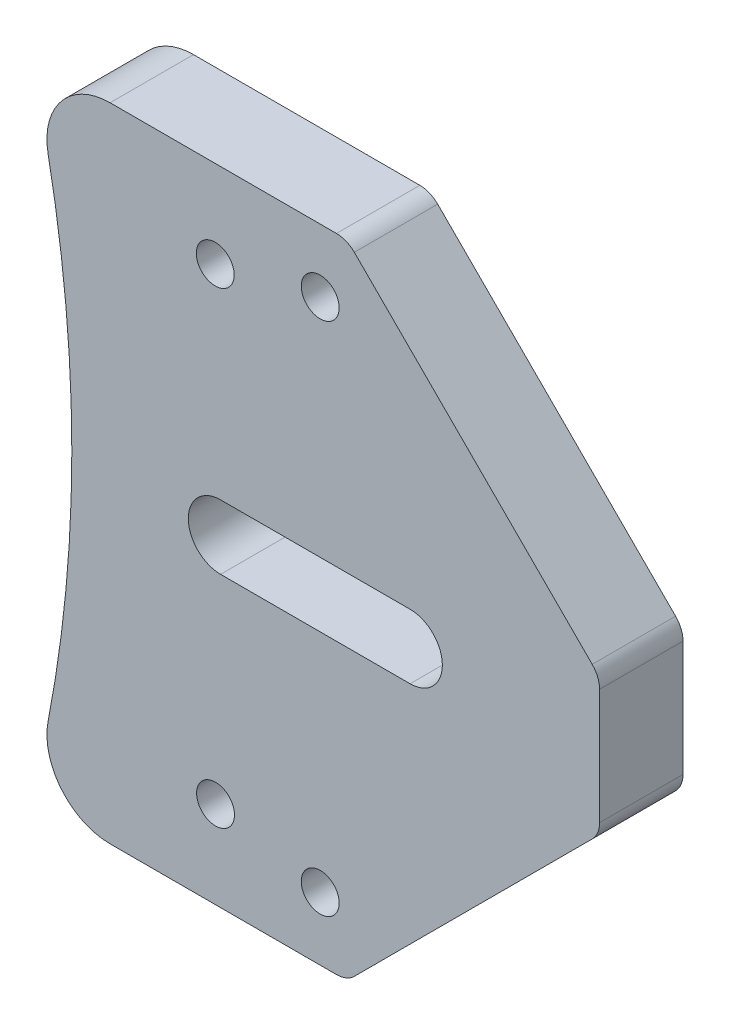
ISO-10303-21;
HEADER;
FILE_DESCRIPTION(('STEP AP214'),'2;1');
FILE_NAME('part.step','',(''),(''),'','','');
FILE_SCHEMA(('AUTOMOTIVE_DESIGN { 1 0 10303 214 1 1 1 1 }'));
ENDSEC;
DATA;
#1=APPLICATION_CONTEXT('core data for automotive mechanical design processes');
#2=APPLICATION_PROTOCOL_DEFINITION('international standard','automotive_design',2000,#1);
#3=PRODUCT_CONTEXT('',#1,'mechanical');
#4=PRODUCT('Part','Part','',(#3));
#5=PRODUCT_RELATED_PRODUCT_CATEGORY('part','',(#4));
#6=PRODUCT_DEFINITION_FORMATION('','',#4);
#7=PRODUCT_DEFINITION_CONTEXT('part definition',#1,'design');
#8=PRODUCT_DEFINITION('design','',#6,#7);
#9=PRODUCT_DEFINITION_SHAPE('','',#8);
#10=(LENGTH_UNIT() NAMED_UNIT(*) SI_UNIT(.MILLI.,.METRE.));
#11=(NAMED_UNIT(*) PLANE_ANGLE_UNIT() SI_UNIT($,.RADIAN.));
#12=(NAMED_UNIT(*) SI_UNIT($,.STERADIAN.) SOLID_ANGLE_UNIT());
#13=UNCERTAINTY_MEASURE_WITH_UNIT(LENGTH_MEASURE(1.E-05),#10,'distance_accuracy_value','');
#14=(GEOMETRIC_REPRESENTATION_CONTEXT(3) GLOBAL_UNCERTAINTY_ASSIGNED_CONTEXT((#13)) GLOBAL_UNIT_ASSIGNED_CONTEXT((#10,
#11,#12)) REPRESENTATION_CONTEXT('',''));
#15=CARTESIAN_POINT('',(0.,0.,0.));
#16=DIRECTION('',(0.,0.,1.));
#17=DIRECTION('',(1.,0.,0.));
#18=AXIS2_PLACEMENT_3D('',#15,#16,#17);
#19=CARTESIAN_POINT('',(20.5,4.5715728752538,6.6));
#20=DIRECTION('',(0.,0.,1.));
#21=DIRECTION('',(1.,0.,0.));
#22=AXIS2_PLACEMENT_3D('',#19,#20,#21);
#23=PLANE('',#22);
#24=CARTESIAN_POINT('',(-7.8991396333,-18.5,6.6));
#25=DIRECTION('',(0.,0.,1.));
#26=DIRECTION('',(1.,0.,0.));
#27=AXIS2_PLACEMENT_3D('',#24,#25,#26);
#28=CIRCLE('',#27,1.50000000000002);
#29=CARTESIAN_POINT('',(-6.39913963329998,-18.5,6.6));
#30=VERTEX_POINT('',#29);
#31=EDGE_CURVE('E182',#30,#30,#28,.T.);
#32=ORIENTED_EDGE('',*,*,#31,.F.);
#33=EDGE_LOOP('',(#32));
#34=FACE_BOUND('',#33,.T.);
#35=CARTESIAN_POINT('',(0.3857864376,-20.4,6.6));
#36=DIRECTION('',(0.,0.,1.));
#37=DIRECTION('',(1.,0.,0.));
#38=AXIS2_PLACEMENT_3D('',#35,#36,#37);
#39=CIRCLE('',#38,1.50000000000009);
#40=CARTESIAN_POINT('',(1.88578643760009,-20.4,6.6));
#41=VERTEX_POINT('',#40);
#42=EDGE_CURVE('E194',#41,#41,#39,.T.);
#43=ORIENTED_EDGE('',*,*,#42,.F.);
#44=EDGE_LOOP('',(#43));
#45=FACE_BOUND('',#44,.T.);
#46=CARTESIAN_POINT('',(20.5,4.5715728752538,6.6));
#47=DIRECTION('',(0.,0.,1.));
#48=DIRECTION('',(1.,0.,0.));
#49=AXIS2_PLACEMENT_3D('',#46,#47,#48);
#50=CIRCLE('',#49,2.00000000000002);
#51=CARTESIAN_POINT('',(22.5,4.5715728753,6.6));
#52=VERTEX_POINT('',#51);
#53=CARTESIAN_POINT('',(21.9142135624,5.9857864376,6.6));
#54=VERTEX_POINT('',#53);
#55=EDGE_CURVE('E206',#52,#54,#50,.T.);
#56=ORIENTED_EDGE('',*,*,#55,.T.);
#57=DIRECTION('',(-0.707106781186547,0.707106781186547,0.));
#58=VECTOR('',#57,1.);
#59=CARTESIAN_POINT('',(21.9142135624,5.9857864376,6.6));
#60=LINE('',#59,#58);
#61=CARTESIAN_POINT('',(3.0857864376,24.8142135624,6.6));
#62=VERTEX_POINT('',#61);
#63=EDGE_CURVE('E209',#54,#62,#60,.T.);
#64=ORIENTED_EDGE('',*,*,#63,.T.);
#65=CARTESIAN_POINT('',(1.67157287525381,23.4,6.6));
#66=DIRECTION('',(0.,0.,1.));
#67=DIRECTION('',(1.,0.,0.));
#68=AXIS2_PLACEMENT_3D('',#65,#66,#67);
#69=CIRCLE('',#68,2.00000000000001);
#70=CARTESIAN_POINT('',(1.6715728753,25.4,6.6));
#71=VERTEX_POINT('',#70);
#72=EDGE_CURVE('E212',#62,#71,#69,.T.);
#73=ORIENTED_EDGE('',*,*,#72,.T.);
#74=DIRECTION('',(-1.,0.,0.));
#75=VECTOR('',#74,1.);
#76=CARTESIAN_POINT('',(1.6715728753,25.4,6.6));
#77=LINE('',#76,#75);
#78=CARTESIAN_POINT('',(-16.2439533295,25.4,6.6));
#79=VERTEX_POINT('',#78);
#80=EDGE_CURVE('E214',#71,#79,#77,.T.);
#81=ORIENTED_EDGE('',*,*,#80,.T.);
#82=CARTESIAN_POINT('',(-16.2439533295,20.4,6.6));
#83=DIRECTION('',(0.,0.,1.));
#84=DIRECTION('',(1.,0.,0.));
#85=AXIS2_PLACEMENT_3D('',#82,#83,#84);
#86=CIRCLE('',#85,5.);
#87=CARTESIAN_POINT('',(-21.1515435576518,19.4431519699825,6.6));
#88=VERTEX_POINT('',#87);
#89=EDGE_CURVE('E216',#79,#88,#86,.T.);
#90=ORIENTED_EDGE('',*,*,#89,.T.);
#91=CARTESIAN_POINT('',(-120.873776993695,2.36315810732406E-11,6.6));
#92=DIRECTION('',(0.,0.,-1.));
#93=DIRECTION('',(1.,0.,0.));
#94=AXIS2_PLACEMENT_3D('',#91,#92,#93);
#95=CIRCLE('',#94,101.599999999998);
#96=CARTESIAN_POINT('',(-21.1515435576556,-19.4431519699543,6.6));
#97=VERTEX_POINT('',#96);
#98=EDGE_CURVE('E218',#88,#97,#95,.T.);
#99=ORIENTED_EDGE('',*,*,#98,.T.);
#100=CARTESIAN_POINT('',(-16.2439533295092,-20.4,6.6));
#101=DIRECTION('',(0.,0.,1.));
#102=DIRECTION('',(1.,0.,0.));
#103=AXIS2_PLACEMENT_3D('',#100,#101,#102);
#104=CIRCLE('',#103,5.00000000000001);
#105=CARTESIAN_POINT('',(-16.2439533295,-25.4,6.6));
#106=VERTEX_POINT('',#105);
#107=EDGE_CURVE('E220',#97,#106,#104,.T.);
#108=ORIENTED_EDGE('',*,*,#107,.T.);
#109=DIRECTION('',(1.,0.,0.));
#110=VECTOR('',#109,1.);
#111=CARTESIAN_POINT('',(-16.2439533295,-25.4,6.6));
#112=LINE('',#111,#110);
#113=CARTESIAN_POINT('',(1.6715728753,-25.4,6.6));
#114=VERTEX_POINT('',#113);
#115=EDGE_CURVE('E222',#106,#114,#112,.T.);
#116=ORIENTED_EDGE('',*,*,#115,.T.);
#117=CARTESIAN_POINT('',(1.67157287525383,-23.4,6.6));
#118=DIRECTION('',(0.,0.,1.));
#119=DIRECTION('',(1.,0.,0.));
#120=AXIS2_PLACEMENT_3D('',#117,#118,#119);
#121=CIRCLE('',#120,1.99999999999995);
#122=CARTESIAN_POINT('',(3.0857864376,-24.8142135624,6.6));
#123=VERTEX_POINT('',#122);
#124=EDGE_CURVE('E224',#114,#123,#121,.T.);
#125=ORIENTED_EDGE('',*,*,#124,.T.);
#126=DIRECTION('',(0.707106781186547,0.707106781186547,0.));
#127=VECTOR('',#126,1.);
#128=CARTESIAN_POINT('',(3.0857864376,-24.8142135624,6.6));
#129=LINE('',#128,#127);
#130=CARTESIAN_POINT('',(21.9142135624,-5.9857864376,6.6));
#131=VERTEX_POINT('',#130);
#132=EDGE_CURVE('E226',#123,#131,#129,.T.);
#133=ORIENTED_EDGE('',*,*,#132,.T.);
#134=CARTESIAN_POINT('',(20.5,-4.57157287525381,6.6));
#135=DIRECTION('',(0.,0.,1.));
#136=DIRECTION('',(1.,0.,0.));
#137=AXIS2_PLACEMENT_3D('',#134,#135,#136);
#138=CIRCLE('',#137,1.99999999999999);
#139=CARTESIAN_POINT('',(22.5,-4.5715728753,6.6));
#140=VERTEX_POINT('',#139);
#141=EDGE_CURVE('E228',#131,#140,#138,.T.);
#142=ORIENTED_EDGE('',*,*,#141,.T.);
#143=DIRECTION('',(0.,1.,0.));
#144=VECTOR('',#143,1.);
#145=CARTESIAN_POINT('',(22.5,-4.5715728753,6.6));
#146=LINE('',#145,#144);
#147=EDGE_CURVE('E230',#140,#52,#146,.T.);
#148=ORIENTED_EDGE('',*,*,#147,.T.);
#149=EDGE_LOOP('',(#56,#64,#73,#81,#90,#99,#108,#116,#125,#133,#142,#148));
#150=FACE_BOUND('',#149,.T.);
#151=CARTESIAN_POINT('',(0.3857864376,20.4,6.6));
#152=DIRECTION('',(0.,0.,1.));
#153=DIRECTION('',(1.,0.,0.));
#154=AXIS2_PLACEMENT_3D('',#151,#152,#153);
#155=CIRCLE('',#154,1.50000000000008);
#156=CARTESIAN_POINT('',(1.88578643760008,20.4,6.6));
#157=VERTEX_POINT('',#156);
#158=EDGE_CURVE('E200',#157,#157,#155,.T.);
#159=ORIENTED_EDGE('',*,*,#158,.F.);
#160=EDGE_LOOP('',(#159));
#161=FACE_BOUND('',#160,.T.);
#162=CARTESIAN_POINT('',(-7.922562904,18.5,6.6));
#163=DIRECTION('',(0.,0.,1.));
#164=DIRECTION('',(1.,0.,0.));
#165=AXIS2_PLACEMENT_3D('',#162,#163,#164);
#166=CIRCLE('',#165,1.5);
#167=CARTESIAN_POINT('',(-6.422562904,18.5,6.6));
#168=VERTEX_POINT('',#167);
#169=EDGE_CURVE('E188',#168,#168,#166,.T.);
#170=ORIENTED_EDGE('',*,*,#169,.F.);
#171=EDGE_LOOP('',(#170));
#172=FACE_BOUND('',#171,.T.);
#173=DIRECTION('',(1.,0.,0.));
#174=VECTOR('',#173,1.);
#175=CARTESIAN_POINT('',(-7.5,-2.5527,6.6));
#176=LINE('',#175,#174);
#177=CARTESIAN_POINT('',(-7.5,-2.5527,6.6));
#178=VERTEX_POINT('',#177);
#179=CARTESIAN_POINT('',(7.5,-2.5527,6.6));
#180=VERTEX_POINT('',#179);
#181=EDGE_CURVE('E154',#178,#180,#176,.T.);
#182=ORIENTED_EDGE('',*,*,#181,.F.);
#183=CARTESIAN_POINT('',(-7.5,0.,6.6));
#184=DIRECTION('',(0.,0.,1.));
#185=DIRECTION('',(1.,0.,0.));
#186=AXIS2_PLACEMENT_3D('',#183,#184,#185);
#187=CIRCLE('',#186,2.5527);
#188=CARTESIAN_POINT('',(-7.5,2.5527,6.6));
#189=VERTEX_POINT('',#188);
#190=EDGE_CURVE('E146',#189,#178,#187,.T.);
#191=ORIENTED_EDGE('',*,*,#190,.F.);
#192=DIRECTION('',(-1.,0.,0.));
#193=VECTOR('',#192,1.);
#194=CARTESIAN_POINT('',(7.5,2.5527,6.6));
#195=LINE('',#194,#193);
#196=CARTESIAN_POINT('',(7.5,2.5527,6.6));
#197=VERTEX_POINT('',#196);
#198=EDGE_CURVE('E168',#197,#189,#195,.T.);
#199=ORIENTED_EDGE('',*,*,#198,.F.);
#200=CARTESIAN_POINT('',(7.5,0.,6.6));
#201=DIRECTION('',(0.,0.,1.));
#202=DIRECTION('',(1.,0.,0.));
#203=AXIS2_PLACEMENT_3D('',#200,#201,#202);
#204=CIRCLE('',#203,2.5527);
#205=EDGE_CURVE('E166',#180,#197,#204,.T.);
#206=ORIENTED_EDGE('',*,*,#205,.F.);
#207=EDGE_LOOP('',(#182,#191,#199,#206));
#208=FACE_BOUND('',#207,.T.);
#209=ADVANCED_FACE('F33',(#34,#45,#150,#161,#172,#208),#23,.T.);
#210=CARTESIAN_POINT('',(20.5,4.5715728752538,0.));
#211=DIRECTION('',(0.,0.,1.));
#212=DIRECTION('',(1.,0.,0.));
#213=AXIS2_PLACEMENT_3D('',#210,#211,#212);
#214=PLANE('',#213);
#215=CARTESIAN_POINT('',(-7.8991396333,-18.5,0.));
#216=DIRECTION('',(0.,0.,1.));
#217=DIRECTION('',(1.,0.,0.));
#218=AXIS2_PLACEMENT_3D('',#215,#216,#217);
#219=CIRCLE('',#218,1.50000000000002);
#220=CARTESIAN_POINT('',(-6.39913963329998,-18.5,0.));
#221=VERTEX_POINT('',#220);
#222=EDGE_CURVE('E162',#221,#221,#219,.T.);
#223=ORIENTED_EDGE('',*,*,#222,.T.);
#224=EDGE_LOOP('',(#223));
#225=FACE_BOUND('',#224,.T.);
#226=CARTESIAN_POINT('',(0.3857864376,-20.4,0.));
#227=DIRECTION('',(0.,0.,1.));
#228=DIRECTION('',(1.,0.,0.));
#229=AXIS2_PLACEMENT_3D('',#226,#227,#228);
#230=CIRCLE('',#229,1.50000000000009);
#231=CARTESIAN_POINT('',(1.88578643760009,-20.4,0.));
#232=VERTEX_POINT('',#231);
#233=EDGE_CURVE('E191',#232,#232,#230,.T.);
#234=ORIENTED_EDGE('',*,*,#233,.T.);
#235=EDGE_LOOP('',(#234));
#236=FACE_BOUND('',#235,.T.);
#237=CARTESIAN_POINT('',(20.5,4.5715728752538,0.));
#238=DIRECTION('',(0.,0.,1.));
#239=DIRECTION('',(1.,0.,0.));
#240=AXIS2_PLACEMENT_3D('',#237,#238,#239);
#241=CIRCLE('',#240,2.00000000000002);
#242=CARTESIAN_POINT('',(22.5,4.5715728753,0.));
#243=VERTEX_POINT('',#242);
#244=CARTESIAN_POINT('',(21.9142135624,5.9857864376,0.));
#245=VERTEX_POINT('',#244);
#246=EDGE_CURVE('E203',#243,#245,#241,.T.);
#247=ORIENTED_EDGE('',*,*,#246,.F.);
#248=DIRECTION('',(0.,1.,0.));
#249=VECTOR('',#248,1.);
#250=CARTESIAN_POINT('',(22.5,-4.5715728753,0.));
#251=LINE('',#250,#249);
#252=CARTESIAN_POINT('',(22.5,-4.5715728753,0.));
#253=VERTEX_POINT('',#252);
#254=EDGE_CURVE('E210',#253,#243,#251,.T.);
#255=ORIENTED_EDGE('',*,*,#254,.F.);
#256=CARTESIAN_POINT('',(20.5,-4.57157287525381,0.));
#257=DIRECTION('',(0.,0.,1.));
#258=DIRECTION('',(1.,0.,0.));
#259=AXIS2_PLACEMENT_3D('',#256,#257,#258);
#260=CIRCLE('',#259,1.99999999999999);
#261=CARTESIAN_POINT('',(21.9142135624,-5.9857864376,0.));
#262=VERTEX_POINT('',#261);
#263=EDGE_CURVE('E253',#262,#253,#260,.T.);
#264=ORIENTED_EDGE('',*,*,#263,.F.);
#265=DIRECTION('',(0.707106781186547,0.707106781186547,0.));
#266=VECTOR('',#265,1.);
#267=CARTESIAN_POINT('',(3.0857864376,-24.8142135624,0.));
#268=LINE('',#267,#266);
#269=CARTESIAN_POINT('',(3.0857864376,-24.8142135624,0.));
#270=VERTEX_POINT('',#269);
#271=EDGE_CURVE('E251',#270,#262,#268,.T.);
#272=ORIENTED_EDGE('',*,*,#271,.F.);
#273=CARTESIAN_POINT('',(1.67157287525383,-23.4,0.));
#274=DIRECTION('',(0.,0.,1.));
#275=DIRECTION('',(1.,0.,0.));
#276=AXIS2_PLACEMENT_3D('',#273,#274,#275);
#277=CIRCLE('',#276,1.99999999999995);
#278=CARTESIAN_POINT('',(1.6715728753,-25.4,0.));
#279=VERTEX_POINT('',#278);
#280=EDGE_CURVE('E249',#279,#270,#277,.T.);
#281=ORIENTED_EDGE('',*,*,#280,.F.);
#282=DIRECTION('',(1.,0.,0.));
#283=VECTOR('',#282,1.);
#284=CARTESIAN_POINT('',(-16.2439533295,-25.4,0.));
#285=LINE('',#284,#283);
#286=CARTESIAN_POINT('',(-16.2439533295,-25.4,0.));
#287=VERTEX_POINT('',#286);
#288=EDGE_CURVE('E247',#287,#279,#285,.T.);
#289=ORIENTED_EDGE('',*,*,#288,.F.);
#290=CARTESIAN_POINT('',(-16.2439533295092,-20.4,0.));
#291=DIRECTION('',(0.,0.,1.));
#292=DIRECTION('',(1.,0.,0.));
#293=AXIS2_PLACEMENT_3D('',#290,#291,#292);
#294=CIRCLE('',#293,5.00000000000001);
#295=CARTESIAN_POINT('',(-21.1515435576556,-19.4431519699543,0.));
#296=VERTEX_POINT('',#295);
#297=EDGE_CURVE('E245',#296,#287,#294,.T.);
#298=ORIENTED_EDGE('',*,*,#297,.F.);
#299=CARTESIAN_POINT('',(-120.873776993695,2.36315810732406E-11,0.));
#300=DIRECTION('',(0.,0.,-1.));
#301=DIRECTION('',(1.,0.,0.));
#302=AXIS2_PLACEMENT_3D('',#299,#300,#301);
#303=CIRCLE('',#302,101.599999999998);
#304=CARTESIAN_POINT('',(-21.1515435576518,19.4431519699825,0.));
#305=VERTEX_POINT('',#304);
#306=EDGE_CURVE('E243',#305,#296,#303,.T.);
#307=ORIENTED_EDGE('',*,*,#306,.F.);
#308=CARTESIAN_POINT('',(-16.2439533295,20.4,0.));
#309=DIRECTION('',(0.,0.,1.));
#310=DIRECTION('',(1.,0.,0.));
#311=AXIS2_PLACEMENT_3D('',#308,#309,#310);
#312=CIRCLE('',#311,5.);
#313=CARTESIAN_POINT('',(-16.2439533295,25.4,0.));
#314=VERTEX_POINT('',#313);
#315=EDGE_CURVE('E241',#314,#305,#312,.T.);
#316=ORIENTED_EDGE('',*,*,#315,.F.);
#317=DIRECTION('',(-1.,0.,0.));
#318=VECTOR('',#317,1.);
#319=CARTESIAN_POINT('',(1.6715728753,25.4,0.));
#320=LINE('',#319,#318);
#321=CARTESIAN_POINT('',(1.6715728753,25.4,0.));
#322=VERTEX_POINT('',#321);
#323=EDGE_CURVE('E239',#322,#314,#320,.T.);
#324=ORIENTED_EDGE('',*,*,#323,.F.);
#325=CARTESIAN_POINT('',(1.67157287525381,23.4,0.));
#326=DIRECTION('',(0.,0.,1.));
#327=DIRECTION('',(1.,0.,0.));
#328=AXIS2_PLACEMENT_3D('',#325,#326,#327);
#329=CIRCLE('',#328,2.00000000000001);
#330=CARTESIAN_POINT('',(3.0857864376,24.8142135624,0.));
#331=VERTEX_POINT('',#330);
#332=EDGE_CURVE('E237',#331,#322,#329,.T.);
#333=ORIENTED_EDGE('',*,*,#332,.F.);
#334=DIRECTION('',(-0.707106781186547,0.707106781186547,0.));
#335=VECTOR('',#334,1.);
#336=CARTESIAN_POINT('',(21.9142135624,5.9857864376,0.));
#337=LINE('',#336,#335);
#338=EDGE_CURVE('E235',#245,#331,#337,.T.);
#339=ORIENTED_EDGE('',*,*,#338,.F.);
#340=EDGE_LOOP('',(#247,#255,#264,#272,#281,#289,#298,#307,#316,#324,#333,#339));
#341=FACE_BOUND('',#340,.T.);
#342=CARTESIAN_POINT('',(0.3857864376,20.4,0.));
#343=DIRECTION('',(0.,0.,1.));
#344=DIRECTION('',(1.,0.,0.));
#345=AXIS2_PLACEMENT_3D('',#342,#343,#344);
#346=CIRCLE('',#345,1.50000000000008);
#347=CARTESIAN_POINT('',(1.88578643760008,20.4,0.));
#348=VERTEX_POINT('',#347);
#349=EDGE_CURVE('E197',#348,#348,#346,.T.);
#350=ORIENTED_EDGE('',*,*,#349,.T.);
#351=EDGE_LOOP('',(#350));
#352=FACE_BOUND('',#351,.T.);
#353=CARTESIAN_POINT('',(-7.922562904,18.5,0.));
#354=DIRECTION('',(0.,0.,1.));
#355=DIRECTION('',(1.,0.,0.));
#356=AXIS2_PLACEMENT_3D('',#353,#354,#355);
#357=CIRCLE('',#356,1.5);
#358=CARTESIAN_POINT('',(-6.422562904,18.5,0.));
#359=VERTEX_POINT('',#358);
#360=EDGE_CURVE('E185',#359,#359,#357,.T.);
#361=ORIENTED_EDGE('',*,*,#360,.T.);
#362=EDGE_LOOP('',(#361));
#363=FACE_BOUND('',#362,.T.);
#364=CARTESIAN_POINT('',(-7.5,0.,0.));
#365=DIRECTION('',(0.,0.,1.));
#366=DIRECTION('',(1.,0.,0.));
#367=AXIS2_PLACEMENT_3D('',#364,#365,#366);
#368=CIRCLE('',#367,2.5527);
#369=CARTESIAN_POINT('',(-7.5,2.5527,0.));
#370=VERTEX_POINT('',#369);
#371=CARTESIAN_POINT('',(-7.5,-2.5527,0.));
#372=VERTEX_POINT('',#371);
#373=EDGE_CURVE('E56',#370,#372,#368,.T.);
#374=ORIENTED_EDGE('',*,*,#373,.T.);
#375=DIRECTION('',(1.,0.,0.));
#376=VECTOR('',#375,1.);
#377=CARTESIAN_POINT('',(-7.5,-2.5527,0.));
#378=LINE('',#377,#376);
#379=CARTESIAN_POINT('',(7.5,-2.5527,0.));
#380=VERTEX_POINT('',#379);
#381=EDGE_CURVE('E161',#372,#380,#378,.T.);
#382=ORIENTED_EDGE('',*,*,#381,.T.);
#383=CARTESIAN_POINT('',(7.5,0.,0.));
#384=DIRECTION('',(0.,0.,1.));
#385=DIRECTION('',(1.,0.,0.));
#386=AXIS2_PLACEMENT_3D('',#383,#384,#385);
#387=CIRCLE('',#386,2.5527);
#388=CARTESIAN_POINT('',(7.5,2.5527,0.));
#389=VERTEX_POINT('',#388);
#390=EDGE_CURVE('E174',#380,#389,#387,.T.);
#391=ORIENTED_EDGE('',*,*,#390,.T.);
#392=DIRECTION('',(-1.,0.,0.));
#393=VECTOR('',#392,1.);
#394=CARTESIAN_POINT('',(7.5,2.5527,0.));
#395=LINE('',#394,#393);
#396=EDGE_CURVE('E155',#389,#370,#395,.T.);
#397=ORIENTED_EDGE('',*,*,#396,.T.);
#398=EDGE_LOOP('',(#374,#382,#391,#397));
#399=FACE_BOUND('',#398,.T.);
#400=ADVANCED_FACE('F295',(#225,#236,#341,#352,#363,#399),#214,.F.);
#401=CARTESIAN_POINT('',(20.5,4.5715728752538,6.6));
#402=DIRECTION('',(0.,0.,-1.));
#403=DIRECTION('',(-1.,0.,0.));
#404=AXIS2_PLACEMENT_3D('',#401,#402,#403);
#405=CYLINDRICAL_SURFACE('',#404,2.00000000000002);
#406=ORIENTED_EDGE('',*,*,#246,.T.);
#407=DIRECTION('',(0.,0.,-1.));
#408=VECTOR('',#407,1.);
#409=CARTESIAN_POINT('',(21.9142135624,5.9857864376,6.6));
#410=LINE('',#409,#408);
#411=EDGE_CURVE('E11',#54,#245,#410,.T.);
#412=ORIENTED_EDGE('',*,*,#411,.F.);
#413=ORIENTED_EDGE('',*,*,#55,.F.);
#414=DIRECTION('',(0.,0.,-1.));
#415=VECTOR('',#414,1.);
#416=CARTESIAN_POINT('',(22.5,4.5715728753,6.6));
#417=LINE('',#416,#415);
#418=EDGE_CURVE('E232',#52,#243,#417,.T.);
#419=ORIENTED_EDGE('',*,*,#418,.T.);
#420=EDGE_LOOP('',(#406,#412,#413,#419));
#421=FACE_BOUND('',#420,.T.);
#422=ADVANCED_FACE('F35',(#421),#405,.T.);
#423=CARTESIAN_POINT('',(21.9142135624,5.9857864376,6.6));
#424=DIRECTION('',(-0.707106781186547,-0.707106781186547,0.));
#425=DIRECTION('',(0.707106781186548,-0.707106781186548,0.));
#426=AXIS2_PLACEMENT_3D('',#423,#424,#425);
#427=PLANE('',#426);
#428=ORIENTED_EDGE('',*,*,#338,.T.);
#429=DIRECTION('',(0.,0.,-1.));
#430=VECTOR('',#429,1.);
#431=CARTESIAN_POINT('',(3.0857864376,24.8142135624,6.6));
#432=LINE('',#431,#430);
#433=EDGE_CURVE('E41',#62,#331,#432,.T.);
#434=ORIENTED_EDGE('',*,*,#433,.F.);
#435=ORIENTED_EDGE('',*,*,#63,.F.);
#436=ORIENTED_EDGE('',*,*,#411,.T.);
#437=EDGE_LOOP('',(#428,#434,#435,#436));
#438=FACE_BOUND('',#437,.T.);
#439=ADVANCED_FACE('F313',(#438),#427,.F.);
#440=CARTESIAN_POINT('',(1.67157287525381,23.4,6.6));
#441=DIRECTION('',(0.,0.,-1.));
#442=DIRECTION('',(-1.,0.,0.));
#443=AXIS2_PLACEMENT_3D('',#440,#441,#442);
#444=CYLINDRICAL_SURFACE('',#443,2.00000000000001);
#445=ORIENTED_EDGE('',*,*,#332,.T.);
#446=DIRECTION('',(0.,0.,-1.));
#447=VECTOR('',#446,1.);
#448=CARTESIAN_POINT('',(1.6715728753,25.4,6.6));
#449=LINE('',#448,#447);
#450=EDGE_CURVE('E282',#71,#322,#449,.T.);
#451=ORIENTED_EDGE('',*,*,#450,.F.);
#452=ORIENTED_EDGE('',*,*,#72,.F.);
#453=ORIENTED_EDGE('',*,*,#433,.T.);
#454=EDGE_LOOP('',(#445,#451,#452,#453));
#455=FACE_BOUND('',#454,.T.);
#456=ADVANCED_FACE('F289',(#455),#444,.T.);
#457=CARTESIAN_POINT('',(1.6715728753,25.4,6.6));
#458=DIRECTION('',(0.,-1.,0.));
#459=DIRECTION('',(0.,0.,-1.));
#460=AXIS2_PLACEMENT_3D('',#457,#458,#459);
#461=PLANE('',#460);
#462=ORIENTED_EDGE('',*,*,#323,.T.);
#463=DIRECTION('',(0.,0.,-1.));
#464=VECTOR('',#463,1.);
#465=CARTESIAN_POINT('',(-16.2439533295,25.4,6.6));
#466=LINE('',#465,#464);
#467=EDGE_CURVE('E279',#79,#314,#466,.T.);
#468=ORIENTED_EDGE('',*,*,#467,.F.);
#469=ORIENTED_EDGE('',*,*,#80,.F.);
#470=ORIENTED_EDGE('',*,*,#450,.T.);
#471=EDGE_LOOP('',(#462,#468,#469,#470));
#472=FACE_BOUND('',#471,.T.);
#473=ADVANCED_FACE('F301',(#472),#461,.F.);
#474=CARTESIAN_POINT('',(-16.2439533295,20.4,6.6));
#475=DIRECTION('',(0.,0.,-1.));
#476=DIRECTION('',(-1.,0.,0.));
#477=AXIS2_PLACEMENT_3D('',#474,#475,#476);
#478=CYLINDRICAL_SURFACE('',#477,5.);
#479=ORIENTED_EDGE('',*,*,#315,.T.);
#480=DIRECTION('',(0.,0.,-1.));
#481=VECTOR('',#480,1.);
#482=CARTESIAN_POINT('',(-21.1515435576518,19.4431519699825,6.6));
#483=LINE('',#482,#481);
#484=EDGE_CURVE('E276',#88,#305,#483,.T.);
#485=ORIENTED_EDGE('',*,*,#484,.F.);
#486=ORIENTED_EDGE('',*,*,#89,.F.);
#487=ORIENTED_EDGE('',*,*,#467,.T.);
#488=EDGE_LOOP('',(#479,#485,#486,#487));
#489=FACE_BOUND('',#488,.T.);
#490=ADVANCED_FACE('F305',(#489),#478,.T.);
#491=CARTESIAN_POINT('',(-120.873776993695,2.36315810732406E-11,6.6));
#492=DIRECTION('',(0.,0.,-1.));
#493=DIRECTION('',(-1.,0.,0.));
#494=AXIS2_PLACEMENT_3D('',#491,#492,#493);
#495=CYLINDRICAL_SURFACE('',#494,101.599999999998);
#496=ORIENTED_EDGE('',*,*,#306,.T.);
#497=DIRECTION('',(0.,0.,-1.));
#498=VECTOR('',#497,1.);
#499=CARTESIAN_POINT('',(-21.1515435576556,-19.4431519699543,6.6));
#500=LINE('',#499,#498);
#501=EDGE_CURVE('E273',#97,#296,#500,.T.);
#502=ORIENTED_EDGE('',*,*,#501,.F.);
#503=ORIENTED_EDGE('',*,*,#98,.F.);
#504=ORIENTED_EDGE('',*,*,#484,.T.);
#505=EDGE_LOOP('',(#496,#502,#503,#504));
#506=FACE_BOUND('',#505,.T.);
#507=ADVANCED_FACE('F346',(#506),#495,.F.);
#508=CARTESIAN_POINT('',(-16.2439533295092,-20.4,6.6));
#509=DIRECTION('',(0.,0.,-1.));
#510=DIRECTION('',(-1.,0.,0.));
#511=AXIS2_PLACEMENT_3D('',#508,#509,#510);
#512=CYLINDRICAL_SURFACE('',#511,5.00000000000001);
#513=ORIENTED_EDGE('',*,*,#297,.T.);
#514=DIRECTION('',(0.,0.,-1.));
#515=VECTOR('',#514,1.);
#516=CARTESIAN_POINT('',(-16.2439533295,-25.4,6.6));
#517=LINE('',#516,#515);
#518=EDGE_CURVE('E270',#106,#287,#517,.T.);
#519=ORIENTED_EDGE('',*,*,#518,.F.);
#520=ORIENTED_EDGE('',*,*,#107,.F.);
#521=ORIENTED_EDGE('',*,*,#501,.T.);
#522=EDGE_LOOP('',(#513,#519,#520,#521));
#523=FACE_BOUND('',#522,.T.);
#524=ADVANCED_FACE('F344',(#523),#512,.T.);
#525=CARTESIAN_POINT('',(-16.2439533295,-25.4,6.6));
#526=DIRECTION('',(0.,1.,0.));
#527=DIRECTION('',(0.,0.,1.));
#528=AXIS2_PLACEMENT_3D('',#525,#526,#527);
#529=PLANE('',#528);
#530=ORIENTED_EDGE('',*,*,#288,.T.);
#531=DIRECTION('',(0.,0.,-1.));
#532=VECTOR('',#531,1.);
#533=CARTESIAN_POINT('',(1.6715728753,-25.4,6.6));
#534=LINE('',#533,#532);
#535=EDGE_CURVE('E267',#114,#279,#534,.T.);
#536=ORIENTED_EDGE('',*,*,#535,.F.);
#537=ORIENTED_EDGE('',*,*,#115,.F.);
#538=ORIENTED_EDGE('',*,*,#518,.T.);
#539=EDGE_LOOP('',(#530,#536,#537,#538));
#540=FACE_BOUND('',#539,.T.);
#541=ADVANCED_FACE('F340',(#540),#529,.F.);
#542=CARTESIAN_POINT('',(1.67157287525383,-23.4,6.6));
#543=DIRECTION('',(0.,0.,-1.));
#544=DIRECTION('',(-1.,0.,0.));
#545=AXIS2_PLACEMENT_3D('',#542,#543,#544);
#546=CYLINDRICAL_SURFACE('',#545,1.99999999999995);
#547=ORIENTED_EDGE('',*,*,#280,.T.);
#548=DIRECTION('',(0.,0.,-1.));
#549=VECTOR('',#548,1.);
#550=CARTESIAN_POINT('',(3.0857864376,-24.8142135624,6.6));
#551=LINE('',#550,#549);
#552=EDGE_CURVE('E264',#123,#270,#551,.T.);
#553=ORIENTED_EDGE('',*,*,#552,.F.);
#554=ORIENTED_EDGE('',*,*,#124,.F.);
#555=ORIENTED_EDGE('',*,*,#535,.T.);
#556=EDGE_LOOP('',(#547,#553,#554,#555));
#557=FACE_BOUND('',#556,.T.);
#558=ADVANCED_FACE('F335',(#557),#546,.T.);
#559=CARTESIAN_POINT('',(3.0857864376,-24.8142135624,6.6));
#560=DIRECTION('',(-0.707106781186547,0.707106781186547,0.));
#561=DIRECTION('',(-0.707106781186548,-0.707106781186548,0.));
#562=AXIS2_PLACEMENT_3D('',#559,#560,#561);
#563=PLANE('',#562);
#564=ORIENTED_EDGE('',*,*,#271,.T.);
#565=DIRECTION('',(0.,0.,-1.));
#566=VECTOR('',#565,1.);
#567=CARTESIAN_POINT('',(21.9142135624,-5.9857864376,6.6));
#568=LINE('',#567,#566);
#569=EDGE_CURVE('E261',#131,#262,#568,.T.);
#570=ORIENTED_EDGE('',*,*,#569,.F.);
#571=ORIENTED_EDGE('',*,*,#132,.F.);
#572=ORIENTED_EDGE('',*,*,#552,.T.);
#573=EDGE_LOOP('',(#564,#570,#571,#572));
#574=FACE_BOUND('',#573,.T.);
#575=ADVANCED_FACE('F329',(#574),#563,.F.);
#576=CARTESIAN_POINT('',(20.5,-4.57157287525381,6.6));
#577=DIRECTION('',(0.,0.,-1.));
#578=DIRECTION('',(-1.,0.,0.));
#579=AXIS2_PLACEMENT_3D('',#576,#577,#578);
#580=CYLINDRICAL_SURFACE('',#579,1.99999999999999);
#581=ORIENTED_EDGE('',*,*,#263,.T.);
#582=DIRECTION('',(0.,0.,-1.));
#583=VECTOR('',#582,1.);
#584=CARTESIAN_POINT('',(22.5,-4.5715728753,6.6));
#585=LINE('',#584,#583);
#586=EDGE_CURVE('E258',#140,#253,#585,.T.);
#587=ORIENTED_EDGE('',*,*,#586,.F.);
#588=ORIENTED_EDGE('',*,*,#141,.F.);
#589=ORIENTED_EDGE('',*,*,#569,.T.);
#590=EDGE_LOOP('',(#581,#587,#588,#589));
#591=FACE_BOUND('',#590,.T.);
#592=ADVANCED_FACE('F325',(#591),#580,.T.);
#593=CARTESIAN_POINT('',(22.5,-4.5715728753,6.6));
#594=DIRECTION('',(-1.,0.,0.));
#595=DIRECTION('',(0.,0.,1.));
#596=AXIS2_PLACEMENT_3D('',#593,#594,#595);
#597=PLANE('',#596);
#598=ORIENTED_EDGE('',*,*,#254,.T.);
#599=ORIENTED_EDGE('',*,*,#418,.F.);
#600=ORIENTED_EDGE('',*,*,#147,.F.);
#601=ORIENTED_EDGE('',*,*,#586,.T.);
#602=EDGE_LOOP('',(#598,#599,#600,#601));
#603=FACE_BOUND('',#602,.T.);
#604=ADVANCED_FACE('F320',(#603),#597,.F.);
#605=CARTESIAN_POINT('',(0.3857864376,20.4,6.6));
#606=DIRECTION('',(0.,0.,-1.));
#607=DIRECTION('',(-1.,0.,0.));
#608=AXIS2_PLACEMENT_3D('',#605,#606,#607);
#609=CYLINDRICAL_SURFACE('',#608,1.50000000000008);
#610=ORIENTED_EDGE('',*,*,#158,.T.);
#611=EDGE_LOOP('',(#610));
#612=FACE_BOUND('',#611,.T.);
#613=ORIENTED_EDGE('',*,*,#349,.F.);
#614=EDGE_LOOP('',(#613));
#615=FACE_BOUND('',#614,.T.);
#616=ADVANCED_FACE('F366',(#612,#615),#609,.F.);
#617=CARTESIAN_POINT('',(0.3857864376,-20.4,6.6));
#618=DIRECTION('',(0.,0.,-1.));
#619=DIRECTION('',(-1.,0.,0.));
#620=AXIS2_PLACEMENT_3D('',#617,#618,#619);
#621=CYLINDRICAL_SURFACE('',#620,1.50000000000009);
#622=ORIENTED_EDGE('',*,*,#42,.T.);
#623=EDGE_LOOP('',(#622));
#624=FACE_BOUND('',#623,.T.);
#625=ORIENTED_EDGE('',*,*,#233,.F.);
#626=EDGE_LOOP('',(#625));
#627=FACE_BOUND('',#626,.T.);
#628=ADVANCED_FACE('F404',(#624,#627),#621,.F.);
#629=CARTESIAN_POINT('',(-7.922562904,18.5,6.6));
#630=DIRECTION('',(0.,0.,-1.));
#631=DIRECTION('',(-1.,0.,0.));
#632=AXIS2_PLACEMENT_3D('',#629,#630,#631);
#633=CYLINDRICAL_SURFACE('',#632,1.5);
#634=ORIENTED_EDGE('',*,*,#169,.T.);
#635=EDGE_LOOP('',(#634));
#636=FACE_BOUND('',#635,.T.);
#637=ORIENTED_EDGE('',*,*,#360,.F.);
#638=EDGE_LOOP('',(#637));
#639=FACE_BOUND('',#638,.T.);
#640=ADVANCED_FACE('F411',(#636,#639),#633,.F.);
#641=CARTESIAN_POINT('',(-7.8991396333,-18.5,6.6));
#642=DIRECTION('',(0.,0.,-1.));
#643=DIRECTION('',(-1.,0.,0.));
#644=AXIS2_PLACEMENT_3D('',#641,#642,#643);
#645=CYLINDRICAL_SURFACE('',#644,1.50000000000002);
#646=ORIENTED_EDGE('',*,*,#31,.T.);
#647=EDGE_LOOP('',(#646));
#648=FACE_BOUND('',#647,.T.);
#649=ORIENTED_EDGE('',*,*,#222,.F.);
#650=EDGE_LOOP('',(#649));
#651=FACE_BOUND('',#650,.T.);
#652=ADVANCED_FACE('F418',(#648,#651),#645,.F.);
#653=CARTESIAN_POINT('',(-7.5,0.,6.6));
#654=DIRECTION('',(0.,0.,-1.));
#655=DIRECTION('',(-1.,0.,0.));
#656=AXIS2_PLACEMENT_3D('',#653,#654,#655);
#657=CYLINDRICAL_SURFACE('',#656,2.5527);
#658=ORIENTED_EDGE('',*,*,#373,.F.);
#659=DIRECTION('',(0.,0.,-1.));
#660=VECTOR('',#659,1.);
#661=CARTESIAN_POINT('',(-7.5,2.5527,6.6));
#662=LINE('',#661,#660);
#663=EDGE_CURVE('E150',#189,#370,#662,.T.);
#664=ORIENTED_EDGE('',*,*,#663,.F.);
#665=ORIENTED_EDGE('',*,*,#190,.T.);
#666=DIRECTION('',(0.,0.,-1.));
#667=VECTOR('',#666,1.);
#668=CARTESIAN_POINT('',(-7.5,-2.5527,6.6));
#669=LINE('',#668,#667);
#670=EDGE_CURVE('E149',#178,#372,#669,.T.);
#671=ORIENTED_EDGE('',*,*,#670,.T.);
#672=EDGE_LOOP('',(#658,#664,#665,#671));
#673=FACE_BOUND('',#672,.T.);
#674=ADVANCED_FACE('F148',(#673),#657,.F.);
#675=CARTESIAN_POINT('',(-7.5,-2.5527,6.6));
#676=DIRECTION('',(0.,1.,0.));
#677=DIRECTION('',(0.,0.,1.));
#678=AXIS2_PLACEMENT_3D('',#675,#676,#677);
#679=PLANE('',#678);
#680=ORIENTED_EDGE('',*,*,#381,.F.);
#681=ORIENTED_EDGE('',*,*,#670,.F.);
#682=ORIENTED_EDGE('',*,*,#181,.T.);
#683=DIRECTION('',(0.,0.,-1.));
#684=VECTOR('',#683,1.);
#685=CARTESIAN_POINT('',(7.5,-2.5527,6.6));
#686=LINE('',#685,#684);
#687=EDGE_CURVE('E163',#180,#380,#686,.T.);
#688=ORIENTED_EDGE('',*,*,#687,.T.);
#689=EDGE_LOOP('',(#680,#681,#682,#688));
#690=FACE_BOUND('',#689,.T.);
#691=ADVANCED_FACE('F158',(#690),#679,.T.);
#692=CARTESIAN_POINT('',(7.5,0.,6.6));
#693=DIRECTION('',(0.,0.,-1.));
#694=DIRECTION('',(-1.,0.,0.));
#695=AXIS2_PLACEMENT_3D('',#692,#693,#694);
#696=CYLINDRICAL_SURFACE('',#695,2.5527);
#697=ORIENTED_EDGE('',*,*,#390,.F.);
#698=ORIENTED_EDGE('',*,*,#687,.F.);
#699=ORIENTED_EDGE('',*,*,#205,.T.);
#700=DIRECTION('',(0.,0.,-1.));
#701=VECTOR('',#700,1.);
#702=CARTESIAN_POINT('',(7.5,2.5527,6.6));
#703=LINE('',#702,#701);
#704=EDGE_CURVE('E48',#197,#389,#703,.T.);
#705=ORIENTED_EDGE('',*,*,#704,.T.);
#706=EDGE_LOOP('',(#697,#698,#699,#705));
#707=FACE_BOUND('',#706,.T.);
#708=ADVANCED_FACE('F439',(#707),#696,.F.);
#709=CARTESIAN_POINT('',(7.5,2.5527,6.6));
#710=DIRECTION('',(0.,-1.,0.));
#711=DIRECTION('',(0.,0.,-1.));
#712=AXIS2_PLACEMENT_3D('',#709,#710,#711);
#713=PLANE('',#712);
#714=ORIENTED_EDGE('',*,*,#396,.F.);
#715=ORIENTED_EDGE('',*,*,#704,.F.);
#716=ORIENTED_EDGE('',*,*,#198,.T.);
#717=ORIENTED_EDGE('',*,*,#663,.T.);
#718=EDGE_LOOP('',(#714,#715,#716,#717));
#719=FACE_BOUND('',#718,.T.);
#720=ADVANCED_FACE('F446',(#719),#713,.T.);
#721=CLOSED_SHELL('',(#209,#400,#422,#439,#456,#473,#490,#507,#524,#541,#558,#575,#592,#604,
#616,#628,#640,#652,#674,#691,#708,#720));
#722=MANIFOLD_SOLID_BREP('B2',#721);
#723=ADVANCED_BREP_SHAPE_REPRESENTATION('',(#18,#722),#14);
#724=SHAPE_DEFINITION_REPRESENTATION(#9,#723);
ENDSEC;
END-ISO-10303-21;
